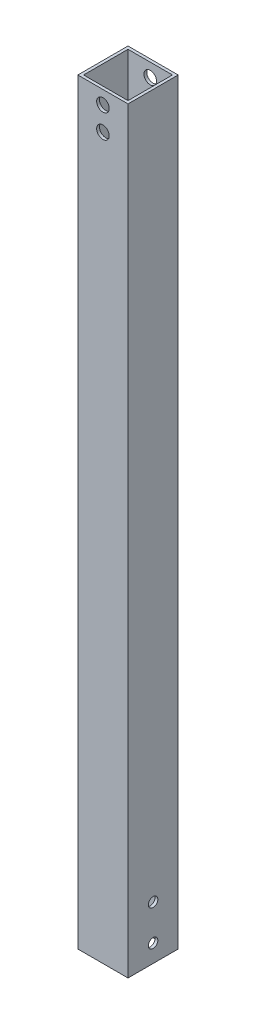
ISO-10303-21;
HEADER;
FILE_DESCRIPTION(('STEP AP214'),'2;1');
FILE_NAME('part.step','',(''),(''),'','','');
FILE_SCHEMA(('AUTOMOTIVE_DESIGN { 1 0 10303 214 1 1 1 1 }'));
ENDSEC;
DATA;
#1=APPLICATION_CONTEXT('core data for automotive mechanical design processes');
#2=APPLICATION_PROTOCOL_DEFINITION('international standard','automotive_design',2000,#1);
#3=PRODUCT_CONTEXT('',#1,'mechanical');
#4=PRODUCT('Part','Part','',(#3));
#5=PRODUCT_RELATED_PRODUCT_CATEGORY('part','',(#4));
#6=PRODUCT_DEFINITION_FORMATION('','',#4);
#7=PRODUCT_DEFINITION_CONTEXT('part definition',#1,'design');
#8=PRODUCT_DEFINITION('design','',#6,#7);
#9=PRODUCT_DEFINITION_SHAPE('','',#8);
#10=(LENGTH_UNIT() NAMED_UNIT(*) SI_UNIT(.MILLI.,.METRE.));
#11=(NAMED_UNIT(*) PLANE_ANGLE_UNIT() SI_UNIT($,.RADIAN.));
#12=(NAMED_UNIT(*) SI_UNIT($,.STERADIAN.) SOLID_ANGLE_UNIT());
#13=UNCERTAINTY_MEASURE_WITH_UNIT(LENGTH_MEASURE(1.E-05),#10,'distance_accuracy_value','');
#14=(GEOMETRIC_REPRESENTATION_CONTEXT(3) GLOBAL_UNCERTAINTY_ASSIGNED_CONTEXT((#13)) GLOBAL_UNIT_ASSIGNED_CONTEXT((#10,
#11,#12)) REPRESENTATION_CONTEXT('',''));
#15=CARTESIAN_POINT('',(0.,0.,0.));
#16=DIRECTION('',(0.,0.,1.));
#17=DIRECTION('',(1.,0.,0.));
#18=AXIS2_PLACEMENT_3D('',#15,#16,#17);
#19=CARTESIAN_POINT('',(0.,406.4,0.));
#20=DIRECTION('',(0.,1.,0.));
#21=DIRECTION('',(0.,0.,1.));
#22=AXIS2_PLACEMENT_3D('',#19,#20,#21);
#23=PLANE('',#22);
#24=DIRECTION('',(0.,0.,1.));
#25=VECTOR('',#24,1.);
#26=CARTESIAN_POINT('',(-13.462,406.4,12.7));
#27=LINE('',#26,#25);
#28=CARTESIAN_POINT('',(-13.462,406.4,-13.462));
#29=VERTEX_POINT('',#28);
#30=CARTESIAN_POINT('',(-13.462,406.4,13.462));
#31=VERTEX_POINT('',#30);
#32=EDGE_CURVE('E173',#29,#31,#27,.T.);
#33=ORIENTED_EDGE('',*,*,#32,.T.);
#34=DIRECTION('',(1.,0.,0.));
#35=VECTOR('',#34,1.);
#36=CARTESIAN_POINT('',(12.7,406.4,13.462));
#37=LINE('',#36,#35);
#38=CARTESIAN_POINT('',(13.462,406.4,13.462));
#39=VERTEX_POINT('',#38);
#40=EDGE_CURVE('E176',#31,#39,#37,.T.);
#41=ORIENTED_EDGE('',*,*,#40,.T.);
#42=DIRECTION('',(0.,0.,-1.));
#43=VECTOR('',#42,1.);
#44=CARTESIAN_POINT('',(13.462,406.4,12.7));
#45=LINE('',#44,#43);
#46=CARTESIAN_POINT('',(13.462,406.4,-13.462));
#47=VERTEX_POINT('',#46);
#48=EDGE_CURVE('E179',#39,#47,#45,.T.);
#49=ORIENTED_EDGE('',*,*,#48,.T.);
#50=DIRECTION('',(-1.,0.,0.));
#51=VECTOR('',#50,1.);
#52=CARTESIAN_POINT('',(12.7,406.4,-13.462));
#53=LINE('',#52,#51);
#54=EDGE_CURVE('E181',#47,#29,#53,.T.);
#55=ORIENTED_EDGE('',*,*,#54,.T.);
#56=EDGE_LOOP('',(#33,#41,#49,#55));
#57=FACE_BOUND('',#56,.T.);
#58=DIRECTION('',(1.,0.,0.));
#59=VECTOR('',#58,1.);
#60=CARTESIAN_POINT('',(12.7,406.4,11.938));
#61=LINE('',#60,#59);
#62=CARTESIAN_POINT('',(-11.938,406.4,11.938));
#63=VERTEX_POINT('',#62);
#64=CARTESIAN_POINT('',(11.938,406.4,11.938));
#65=VERTEX_POINT('',#64);
#66=EDGE_CURVE('E141',#63,#65,#61,.T.);
#67=ORIENTED_EDGE('',*,*,#66,.F.);
#68=DIRECTION('',(0.,0.,1.));
#69=VECTOR('',#68,1.);
#70=CARTESIAN_POINT('',(-11.938,406.4,12.7));
#71=LINE('',#70,#69);
#72=CARTESIAN_POINT('',(-11.938,406.4,-11.938));
#73=VERTEX_POINT('',#72);
#74=EDGE_CURVE('E133',#73,#63,#71,.T.);
#75=ORIENTED_EDGE('',*,*,#74,.F.);
#76=DIRECTION('',(-1.,0.,0.));
#77=VECTOR('',#76,1.);
#78=CARTESIAN_POINT('',(12.7,406.4,-11.938));
#79=LINE('',#78,#77);
#80=CARTESIAN_POINT('',(11.938,406.4,-11.938));
#81=VERTEX_POINT('',#80);
#82=EDGE_CURVE('E156',#81,#73,#79,.T.);
#83=ORIENTED_EDGE('',*,*,#82,.F.);
#84=DIRECTION('',(0.,0.,-1.));
#85=VECTOR('',#84,1.);
#86=CARTESIAN_POINT('',(11.938,406.4,12.7));
#87=LINE('',#86,#85);
#88=EDGE_CURVE('E154',#65,#81,#87,.T.);
#89=ORIENTED_EDGE('',*,*,#88,.F.);
#90=EDGE_LOOP('',(#67,#75,#83,#89));
#91=FACE_BOUND('',#90,.T.);
#92=ADVANCED_FACE('F65',(#57,#91),#23,.T.);
#93=CARTESIAN_POINT('',(0.,0.,0.));
#94=DIRECTION('',(0.,1.,0.));
#95=DIRECTION('',(0.,0.,1.));
#96=AXIS2_PLACEMENT_3D('',#93,#94,#95);
#97=PLANE('',#96);
#98=DIRECTION('',(0.,0.,1.));
#99=VECTOR('',#98,1.);
#100=CARTESIAN_POINT('',(-13.462,0.,12.7));
#101=LINE('',#100,#99);
#102=CARTESIAN_POINT('',(-13.462,0.,-13.462));
#103=VERTEX_POINT('',#102);
#104=CARTESIAN_POINT('',(-13.462,0.,13.462));
#105=VERTEX_POINT('',#104);
#106=EDGE_CURVE('E150',#103,#105,#101,.T.);
#107=ORIENTED_EDGE('',*,*,#106,.F.);
#108=DIRECTION('',(-1.,0.,0.));
#109=VECTOR('',#108,1.);
#110=CARTESIAN_POINT('',(12.7,0.,-13.462));
#111=LINE('',#110,#109);
#112=CARTESIAN_POINT('',(13.462,0.,-13.462));
#113=VERTEX_POINT('',#112);
#114=EDGE_CURVE('E177',#113,#103,#111,.T.);
#115=ORIENTED_EDGE('',*,*,#114,.F.);
#116=DIRECTION('',(0.,0.,-1.));
#117=VECTOR('',#116,1.);
#118=CARTESIAN_POINT('',(13.462,0.,12.7));
#119=LINE('',#118,#117);
#120=CARTESIAN_POINT('',(13.462,0.,13.462));
#121=VERTEX_POINT('',#120);
#122=EDGE_CURVE('E188',#121,#113,#119,.T.);
#123=ORIENTED_EDGE('',*,*,#122,.F.);
#124=DIRECTION('',(1.,0.,0.));
#125=VECTOR('',#124,1.);
#126=CARTESIAN_POINT('',(12.7,0.,13.462));
#127=LINE('',#126,#125);
#128=EDGE_CURVE('E186',#105,#121,#127,.T.);
#129=ORIENTED_EDGE('',*,*,#128,.F.);
#130=EDGE_LOOP('',(#107,#115,#123,#129));
#131=FACE_BOUND('',#130,.T.);
#132=DIRECTION('',(0.,0.,1.));
#133=VECTOR('',#132,1.);
#134=CARTESIAN_POINT('',(-11.938,0.,12.7));
#135=LINE('',#134,#133);
#136=CARTESIAN_POINT('',(-11.938,0.,-11.938));
#137=VERTEX_POINT('',#136);
#138=CARTESIAN_POINT('',(-11.938,0.,11.938));
#139=VERTEX_POINT('',#138);
#140=EDGE_CURVE('E91',#137,#139,#135,.T.);
#141=ORIENTED_EDGE('',*,*,#140,.T.);
#142=DIRECTION('',(1.,0.,0.));
#143=VECTOR('',#142,1.);
#144=CARTESIAN_POINT('',(12.7,0.,11.938));
#145=LINE('',#144,#143);
#146=CARTESIAN_POINT('',(11.938,0.,11.938));
#147=VERTEX_POINT('',#146);
#148=EDGE_CURVE('E148',#139,#147,#145,.T.);
#149=ORIENTED_EDGE('',*,*,#148,.T.);
#150=DIRECTION('',(0.,0.,-1.));
#151=VECTOR('',#150,1.);
#152=CARTESIAN_POINT('',(11.938,0.,12.7));
#153=LINE('',#152,#151);
#154=CARTESIAN_POINT('',(11.938,0.,-11.938));
#155=VERTEX_POINT('',#154);
#156=EDGE_CURVE('E164',#147,#155,#153,.T.);
#157=ORIENTED_EDGE('',*,*,#156,.T.);
#158=DIRECTION('',(-1.,0.,0.));
#159=VECTOR('',#158,1.);
#160=CARTESIAN_POINT('',(12.7,0.,-11.938));
#161=LINE('',#160,#159);
#162=EDGE_CURVE('E142',#155,#137,#161,.T.);
#163=ORIENTED_EDGE('',*,*,#162,.T.);
#164=EDGE_LOOP('',(#141,#149,#157,#163));
#165=FACE_BOUND('',#164,.T.);
#166=ADVANCED_FACE('F258',(#131,#165),#97,.F.);
#167=CARTESIAN_POINT('',(-13.462,406.4,12.7));
#168=DIRECTION('',(1.,0.,0.));
#169=DIRECTION('',(0.,0.,-1.));
#170=AXIS2_PLACEMENT_3D('',#167,#168,#169);
#171=PLANE('',#170);
#172=CARTESIAN_POINT('',(-13.462,9.525,0.));
#173=DIRECTION('',(1.,0.,0.));
#174=DIRECTION('',(0.,0.,-1.));
#175=AXIS2_PLACEMENT_3D('',#172,#173,#174);
#176=CIRCLE('',#175,2.55269999999998);
#177=CARTESIAN_POINT('',(-13.462,9.525,-2.55269999999998));
#178=VERTEX_POINT('',#177);
#179=EDGE_CURVE('E336',#178,#178,#176,.T.);
#180=ORIENTED_EDGE('',*,*,#179,.T.);
#181=EDGE_LOOP('',(#180));
#182=FACE_BOUND('',#181,.T.);
#183=CARTESIAN_POINT('',(-13.462,28.575,0.));
#184=DIRECTION('',(1.,0.,0.));
#185=DIRECTION('',(0.,0.,-1.));
#186=AXIS2_PLACEMENT_3D('',#183,#184,#185);
#187=CIRCLE('',#186,2.55269999999998);
#188=CARTESIAN_POINT('',(-13.462,28.575,-2.55269999999998));
#189=VERTEX_POINT('',#188);
#190=EDGE_CURVE('E210',#189,#189,#187,.T.);
#191=ORIENTED_EDGE('',*,*,#190,.T.);
#192=EDGE_LOOP('',(#191));
#193=FACE_BOUND('',#192,.T.);
#194=ORIENTED_EDGE('',*,*,#106,.T.);
#195=DIRECTION('',(0.,-1.,0.));
#196=VECTOR('',#195,1.);
#197=CARTESIAN_POINT('',(-13.462,406.4,13.462));
#198=LINE('',#197,#196);
#199=EDGE_CURVE('E12',#31,#105,#198,.T.);
#200=ORIENTED_EDGE('',*,*,#199,.F.);
#201=ORIENTED_EDGE('',*,*,#32,.F.);
#202=DIRECTION('',(0.,-1.,0.));
#203=VECTOR('',#202,1.);
#204=CARTESIAN_POINT('',(-13.462,406.4,-13.462));
#205=LINE('',#204,#203);
#206=EDGE_CURVE('E183',#29,#103,#205,.T.);
#207=ORIENTED_EDGE('',*,*,#206,.T.);
#208=EDGE_LOOP('',(#194,#200,#201,#207));
#209=FACE_BOUND('',#208,.T.);
#210=ADVANCED_FACE('F67',(#182,#193,#209),#171,.F.);
#211=CARTESIAN_POINT('',(12.7,406.4,13.462));
#212=DIRECTION('',(0.,0.,-1.));
#213=DIRECTION('',(-1.,0.,0.));
#214=AXIS2_PLACEMENT_3D('',#211,#212,#213);
#215=PLANE('',#214);
#216=CARTESIAN_POINT('',(1.36939071193609E-13,399.2245,13.462));
#217=DIRECTION('',(0.,0.,-1.));
#218=DIRECTION('',(-1.,0.,0.));
#219=AXIS2_PLACEMENT_3D('',#216,#217,#218);
#220=CIRCLE('',#219,3.37819999999998);
#221=CARTESIAN_POINT('',(-3.37819999999984,399.2245,13.462));
#222=VERTEX_POINT('',#221);
#223=EDGE_CURVE('E206',#222,#222,#220,.T.);
#224=ORIENTED_EDGE('',*,*,#223,.T.);
#225=EDGE_LOOP('',(#224));
#226=FACE_BOUND('',#225,.T.);
#227=CARTESIAN_POINT('',(1.68164093761192E-13,386.5245,13.462));
#228=DIRECTION('',(0.,0.,-1.));
#229=DIRECTION('',(-1.,0.,0.));
#230=AXIS2_PLACEMENT_3D('',#227,#228,#229);
#231=CIRCLE('',#230,3.37819999999998);
#232=CARTESIAN_POINT('',(-3.37819999999981,386.5245,13.462));
#233=VERTEX_POINT('',#232);
#234=EDGE_CURVE('E202',#233,#233,#231,.T.);
#235=ORIENTED_EDGE('',*,*,#234,.T.);
#236=EDGE_LOOP('',(#235));
#237=FACE_BOUND('',#236,.T.);
#238=ORIENTED_EDGE('',*,*,#128,.T.);
#239=DIRECTION('',(0.,-1.,0.));
#240=VECTOR('',#239,1.);
#241=CARTESIAN_POINT('',(13.462,406.4,13.462));
#242=LINE('',#241,#240);
#243=EDGE_CURVE('E75',#39,#121,#242,.T.);
#244=ORIENTED_EDGE('',*,*,#243,.F.);
#245=ORIENTED_EDGE('',*,*,#40,.F.);
#246=ORIENTED_EDGE('',*,*,#199,.T.);
#247=EDGE_LOOP('',(#238,#244,#245,#246));
#248=FACE_BOUND('',#247,.T.);
#249=ADVANCED_FACE('F272',(#226,#237,#248),#215,.F.);
#250=CARTESIAN_POINT('',(13.462,406.4,12.7));
#251=DIRECTION('',(-1.,0.,0.));
#252=DIRECTION('',(0.,0.,1.));
#253=AXIS2_PLACEMENT_3D('',#250,#251,#252);
#254=PLANE('',#253);
#255=CARTESIAN_POINT('',(13.462,9.525,0.));
#256=DIRECTION('',(1.,0.,0.));
#257=DIRECTION('',(0.,0.,-1.));
#258=AXIS2_PLACEMENT_3D('',#255,#256,#257);
#259=CIRCLE('',#258,2.55269999999999);
#260=CARTESIAN_POINT('',(13.462,9.525,-2.55269999999999));
#261=VERTEX_POINT('',#260);
#262=EDGE_CURVE('E335',#261,#261,#259,.T.);
#263=ORIENTED_EDGE('',*,*,#262,.F.);
#264=EDGE_LOOP('',(#263));
#265=FACE_BOUND('',#264,.T.);
#266=CARTESIAN_POINT('',(13.462,28.575,0.));
#267=DIRECTION('',(1.,0.,0.));
#268=DIRECTION('',(0.,0.,-1.));
#269=AXIS2_PLACEMENT_3D('',#266,#267,#268);
#270=CIRCLE('',#269,2.55269999999999);
#271=CARTESIAN_POINT('',(13.462,28.575,-2.55269999999999));
#272=VERTEX_POINT('',#271);
#273=EDGE_CURVE('E217',#272,#272,#270,.T.);
#274=ORIENTED_EDGE('',*,*,#273,.F.);
#275=EDGE_LOOP('',(#274));
#276=FACE_BOUND('',#275,.T.);
#277=ORIENTED_EDGE('',*,*,#122,.T.);
#278=DIRECTION('',(0.,-1.,0.));
#279=VECTOR('',#278,1.);
#280=CARTESIAN_POINT('',(13.462,406.4,-13.462));
#281=LINE('',#280,#279);
#282=EDGE_CURVE('E193',#47,#113,#281,.T.);
#283=ORIENTED_EDGE('',*,*,#282,.F.);
#284=ORIENTED_EDGE('',*,*,#48,.F.);
#285=ORIENTED_EDGE('',*,*,#243,.T.);
#286=EDGE_LOOP('',(#277,#283,#284,#285));
#287=FACE_BOUND('',#286,.T.);
#288=ADVANCED_FACE('F269',(#265,#276,#287),#254,.F.);
#289=CARTESIAN_POINT('',(12.7,406.4,-13.462));
#290=DIRECTION('',(0.,0.,1.));
#291=DIRECTION('',(1.,0.,0.));
#292=AXIS2_PLACEMENT_3D('',#289,#290,#291);
#293=PLANE('',#292);
#294=CARTESIAN_POINT('',(1.36939071193609E-13,399.2245,-13.462));
#295=DIRECTION('',(0.,0.,-1.));
#296=DIRECTION('',(-1.,0.,0.));
#297=AXIS2_PLACEMENT_3D('',#294,#295,#296);
#298=CIRCLE('',#297,3.37819999999998);
#299=CARTESIAN_POINT('',(-3.37819999999984,399.2245,-13.462));
#300=VERTEX_POINT('',#299);
#301=EDGE_CURVE('E214',#300,#300,#298,.T.);
#302=ORIENTED_EDGE('',*,*,#301,.F.);
#303=EDGE_LOOP('',(#302));
#304=FACE_BOUND('',#303,.T.);
#305=CARTESIAN_POINT('',(1.68164093761192E-13,386.5245,-13.462));
#306=DIRECTION('',(0.,0.,-1.));
#307=DIRECTION('',(-1.,0.,0.));
#308=AXIS2_PLACEMENT_3D('',#305,#306,#307);
#309=CIRCLE('',#308,3.37819999999998);
#310=CARTESIAN_POINT('',(-3.37819999999981,386.5245,-13.462));
#311=VERTEX_POINT('',#310);
#312=EDGE_CURVE('E232',#311,#311,#309,.T.);
#313=ORIENTED_EDGE('',*,*,#312,.F.);
#314=EDGE_LOOP('',(#313));
#315=FACE_BOUND('',#314,.T.);
#316=ORIENTED_EDGE('',*,*,#114,.T.);
#317=ORIENTED_EDGE('',*,*,#206,.F.);
#318=ORIENTED_EDGE('',*,*,#54,.F.);
#319=ORIENTED_EDGE('',*,*,#282,.T.);
#320=EDGE_LOOP('',(#316,#317,#318,#319));
#321=FACE_BOUND('',#320,.T.);
#322=ADVANCED_FACE('F253',(#304,#315,#321),#293,.F.);
#323=CARTESIAN_POINT('',(-11.938,406.4,12.7));
#324=DIRECTION('',(1.,0.,0.));
#325=DIRECTION('',(0.,0.,-1.));
#326=AXIS2_PLACEMENT_3D('',#323,#324,#325);
#327=PLANE('',#326);
#328=CARTESIAN_POINT('',(-11.938,9.525,0.));
#329=DIRECTION('',(1.,0.,0.));
#330=DIRECTION('',(0.,0.,-1.));
#331=AXIS2_PLACEMENT_3D('',#328,#329,#330);
#332=CIRCLE('',#331,2.55269999999998);
#333=CARTESIAN_POINT('',(-11.938,9.525,-2.55269999999998));
#334=VERTEX_POINT('',#333);
#335=EDGE_CURVE('E222',#334,#334,#332,.T.);
#336=ORIENTED_EDGE('',*,*,#335,.F.);
#337=EDGE_LOOP('',(#336));
#338=FACE_BOUND('',#337,.T.);
#339=CARTESIAN_POINT('',(-11.938,28.575,0.));
#340=DIRECTION('',(1.,0.,0.));
#341=DIRECTION('',(0.,0.,-1.));
#342=AXIS2_PLACEMENT_3D('',#339,#340,#341);
#343=CIRCLE('',#342,2.55269999999998);
#344=CARTESIAN_POINT('',(-11.938,28.575,-2.55269999999998));
#345=VERTEX_POINT('',#344);
#346=EDGE_CURVE('E209',#345,#345,#343,.T.);
#347=ORIENTED_EDGE('',*,*,#346,.F.);
#348=EDGE_LOOP('',(#347));
#349=FACE_BOUND('',#348,.T.);
#350=ORIENTED_EDGE('',*,*,#140,.F.);
#351=DIRECTION('',(0.,-1.,0.));
#352=VECTOR('',#351,1.);
#353=CARTESIAN_POINT('',(-11.938,406.4,-11.938));
#354=LINE('',#353,#352);
#355=EDGE_CURVE('E137',#73,#137,#354,.T.);
#356=ORIENTED_EDGE('',*,*,#355,.F.);
#357=ORIENTED_EDGE('',*,*,#74,.T.);
#358=DIRECTION('',(0.,-1.,0.));
#359=VECTOR('',#358,1.);
#360=CARTESIAN_POINT('',(-11.938,406.4,11.938));
#361=LINE('',#360,#359);
#362=EDGE_CURVE('E136',#63,#139,#361,.T.);
#363=ORIENTED_EDGE('',*,*,#362,.T.);
#364=EDGE_LOOP('',(#350,#356,#357,#363));
#365=FACE_BOUND('',#364,.T.);
#366=ADVANCED_FACE('F135',(#338,#349,#365),#327,.T.);
#367=CARTESIAN_POINT('',(12.7,406.4,11.938));
#368=DIRECTION('',(0.,0.,-1.));
#369=DIRECTION('',(-1.,0.,0.));
#370=AXIS2_PLACEMENT_3D('',#367,#368,#369);
#371=PLANE('',#370);
#372=CARTESIAN_POINT('',(1.36939071193609E-13,399.2245,11.938));
#373=DIRECTION('',(0.,0.,-1.));
#374=DIRECTION('',(-1.,0.,0.));
#375=AXIS2_PLACEMENT_3D('',#372,#373,#374);
#376=CIRCLE('',#375,3.37819999999998);
#377=CARTESIAN_POINT('',(-3.37819999999984,399.2245,11.938));
#378=VERTEX_POINT('',#377);
#379=EDGE_CURVE('E205',#378,#378,#376,.T.);
#380=ORIENTED_EDGE('',*,*,#379,.F.);
#381=EDGE_LOOP('',(#380));
#382=FACE_BOUND('',#381,.T.);
#383=CARTESIAN_POINT('',(1.68164093761192E-13,386.5245,11.938));
#384=DIRECTION('',(0.,0.,-1.));
#385=DIRECTION('',(-1.,0.,0.));
#386=AXIS2_PLACEMENT_3D('',#383,#384,#385);
#387=CIRCLE('',#386,3.37819999999998);
#388=CARTESIAN_POINT('',(-3.37819999999981,386.5245,11.938));
#389=VERTEX_POINT('',#388);
#390=EDGE_CURVE('E162',#389,#389,#387,.T.);
#391=ORIENTED_EDGE('',*,*,#390,.F.);
#392=EDGE_LOOP('',(#391));
#393=FACE_BOUND('',#392,.T.);
#394=ORIENTED_EDGE('',*,*,#148,.F.);
#395=ORIENTED_EDGE('',*,*,#362,.F.);
#396=ORIENTED_EDGE('',*,*,#66,.T.);
#397=DIRECTION('',(0.,-1.,0.));
#398=VECTOR('',#397,1.);
#399=CARTESIAN_POINT('',(11.938,406.4,11.938));
#400=LINE('',#399,#398);
#401=EDGE_CURVE('E151',#65,#147,#400,.T.);
#402=ORIENTED_EDGE('',*,*,#401,.T.);
#403=EDGE_LOOP('',(#394,#395,#396,#402));
#404=FACE_BOUND('',#403,.T.);
#405=ADVANCED_FACE('F145',(#382,#393,#404),#371,.T.);
#406=CARTESIAN_POINT('',(11.938,406.4,12.7));
#407=DIRECTION('',(-1.,0.,0.));
#408=DIRECTION('',(0.,0.,1.));
#409=AXIS2_PLACEMENT_3D('',#406,#407,#408);
#410=PLANE('',#409);
#411=CARTESIAN_POINT('',(11.938,9.525,0.));
#412=DIRECTION('',(-1.,0.,0.));
#413=DIRECTION('',(0.,0.,1.));
#414=AXIS2_PLACEMENT_3D('',#411,#412,#413);
#415=CIRCLE('',#414,2.55269999999998);
#416=CARTESIAN_POINT('',(11.938,9.525,2.55269999999998));
#417=VERTEX_POINT('',#416);
#418=EDGE_CURVE('E69',#417,#417,#415,.T.);
#419=ORIENTED_EDGE('',*,*,#418,.F.);
#420=EDGE_LOOP('',(#419));
#421=FACE_BOUND('',#420,.T.);
#422=CARTESIAN_POINT('',(11.938,28.575,0.));
#423=DIRECTION('',(-1.,0.,0.));
#424=DIRECTION('',(0.,0.,1.));
#425=AXIS2_PLACEMENT_3D('',#422,#423,#424);
#426=CIRCLE('',#425,2.55269999999998);
#427=CARTESIAN_POINT('',(11.938,28.575,2.55269999999998));
#428=VERTEX_POINT('',#427);
#429=EDGE_CURVE('E207',#428,#428,#426,.T.);
#430=ORIENTED_EDGE('',*,*,#429,.F.);
#431=EDGE_LOOP('',(#430));
#432=FACE_BOUND('',#431,.T.);
#433=ORIENTED_EDGE('',*,*,#156,.F.);
#434=ORIENTED_EDGE('',*,*,#401,.F.);
#435=ORIENTED_EDGE('',*,*,#88,.T.);
#436=DIRECTION('',(0.,-1.,0.));
#437=VECTOR('',#436,1.);
#438=CARTESIAN_POINT('',(11.938,406.4,-11.938));
#439=LINE('',#438,#437);
#440=EDGE_CURVE('E83',#81,#155,#439,.T.);
#441=ORIENTED_EDGE('',*,*,#440,.T.);
#442=EDGE_LOOP('',(#433,#434,#435,#441));
#443=FACE_BOUND('',#442,.T.);
#444=ADVANCED_FACE('F243',(#421,#432,#443),#410,.T.);
#445=CARTESIAN_POINT('',(12.7,406.4,-11.938));
#446=DIRECTION('',(0.,0.,1.));
#447=DIRECTION('',(1.,0.,0.));
#448=AXIS2_PLACEMENT_3D('',#445,#446,#447);
#449=PLANE('',#448);
#450=CARTESIAN_POINT('',(1.36939071193609E-13,399.2245,-11.938));
#451=DIRECTION('',(0.,0.,1.));
#452=DIRECTION('',(1.,0.,0.));
#453=AXIS2_PLACEMENT_3D('',#450,#451,#452);
#454=CIRCLE('',#453,3.37819999999998);
#455=CARTESIAN_POINT('',(3.37820000000012,399.2245,-11.938));
#456=VERTEX_POINT('',#455);
#457=EDGE_CURVE('E203',#456,#456,#454,.T.);
#458=ORIENTED_EDGE('',*,*,#457,.F.);
#459=EDGE_LOOP('',(#458));
#460=FACE_BOUND('',#459,.T.);
#461=CARTESIAN_POINT('',(1.68164093761192E-13,386.5245,-11.938));
#462=DIRECTION('',(0.,0.,1.));
#463=DIRECTION('',(1.,0.,0.));
#464=AXIS2_PLACEMENT_3D('',#461,#462,#463);
#465=CIRCLE('',#464,3.37819999999998);
#466=CARTESIAN_POINT('',(3.37820000000015,386.5245,-11.938));
#467=VERTEX_POINT('',#466);
#468=EDGE_CURVE('E199',#467,#467,#465,.T.);
#469=ORIENTED_EDGE('',*,*,#468,.F.);
#470=EDGE_LOOP('',(#469));
#471=FACE_BOUND('',#470,.T.);
#472=ORIENTED_EDGE('',*,*,#162,.F.);
#473=ORIENTED_EDGE('',*,*,#440,.F.);
#474=ORIENTED_EDGE('',*,*,#82,.T.);
#475=ORIENTED_EDGE('',*,*,#355,.T.);
#476=EDGE_LOOP('',(#472,#473,#474,#475));
#477=FACE_BOUND('',#476,.T.);
#478=ADVANCED_FACE('F250',(#460,#471,#477),#449,.T.);
#479=CARTESIAN_POINT('',(1.68164093761192E-13,386.5245,-13.462));
#480=DIRECTION('',(0.,0.,-1.));
#481=DIRECTION('',(-1.,0.,0.));
#482=AXIS2_PLACEMENT_3D('',#479,#480,#481);
#483=CYLINDRICAL_SURFACE('',#482,3.37819999999998);
#484=ORIENTED_EDGE('',*,*,#468,.T.);
#485=EDGE_LOOP('',(#484));
#486=FACE_BOUND('',#485,.T.);
#487=ORIENTED_EDGE('',*,*,#312,.T.);
#488=EDGE_LOOP('',(#487));
#489=FACE_BOUND('',#488,.T.);
#490=ADVANCED_FACE('F300',(#486,#489),#483,.F.);
#491=ORIENTED_EDGE('',*,*,#390,.T.);
#492=EDGE_LOOP('',(#491));
#493=FACE_BOUND('',#492,.T.);
#494=ORIENTED_EDGE('',*,*,#234,.F.);
#495=EDGE_LOOP('',(#494));
#496=FACE_BOUND('',#495,.T.);
#497=ADVANCED_FACE('F239',(#493,#496),#483,.F.);
#498=CARTESIAN_POINT('',(1.36939071193609E-13,399.2245,-13.462));
#499=DIRECTION('',(0.,0.,-1.));
#500=DIRECTION('',(-1.,0.,0.));
#501=AXIS2_PLACEMENT_3D('',#498,#499,#500);
#502=CYLINDRICAL_SURFACE('',#501,3.37819999999998);
#503=ORIENTED_EDGE('',*,*,#457,.T.);
#504=EDGE_LOOP('',(#503));
#505=FACE_BOUND('',#504,.T.);
#506=ORIENTED_EDGE('',*,*,#301,.T.);
#507=EDGE_LOOP('',(#506));
#508=FACE_BOUND('',#507,.T.);
#509=ADVANCED_FACE('F311',(#505,#508),#502,.F.);
#510=ORIENTED_EDGE('',*,*,#379,.T.);
#511=EDGE_LOOP('',(#510));
#512=FACE_BOUND('',#511,.T.);
#513=ORIENTED_EDGE('',*,*,#223,.F.);
#514=EDGE_LOOP('',(#513));
#515=FACE_BOUND('',#514,.T.);
#516=ADVANCED_FACE('F314',(#512,#515),#502,.F.);
#517=CARTESIAN_POINT('',(13.462,28.575,0.));
#518=DIRECTION('',(1.,0.,0.));
#519=DIRECTION('',(0.,0.,-1.));
#520=AXIS2_PLACEMENT_3D('',#517,#518,#519);
#521=CYLINDRICAL_SURFACE('',#520,2.55269999999998);
#522=ORIENTED_EDGE('',*,*,#429,.T.);
#523=EDGE_LOOP('',(#522));
#524=FACE_BOUND('',#523,.T.);
#525=ORIENTED_EDGE('',*,*,#273,.T.);
#526=EDGE_LOOP('',(#525));
#527=FACE_BOUND('',#526,.T.);
#528=ADVANCED_FACE('F316',(#524,#527),#521,.F.);
#529=ORIENTED_EDGE('',*,*,#346,.T.);
#530=EDGE_LOOP('',(#529));
#531=FACE_BOUND('',#530,.T.);
#532=ORIENTED_EDGE('',*,*,#190,.F.);
#533=EDGE_LOOP('',(#532));
#534=FACE_BOUND('',#533,.T.);
#535=ADVANCED_FACE('F319',(#531,#534),#521,.F.);
#536=CARTESIAN_POINT('',(13.462,9.525,0.));
#537=DIRECTION('',(1.,0.,0.));
#538=DIRECTION('',(0.,0.,-1.));
#539=AXIS2_PLACEMENT_3D('',#536,#537,#538);
#540=CYLINDRICAL_SURFACE('',#539,2.55269999999998);
#541=ORIENTED_EDGE('',*,*,#418,.T.);
#542=EDGE_LOOP('',(#541));
#543=FACE_BOUND('',#542,.T.);
#544=ORIENTED_EDGE('',*,*,#262,.T.);
#545=EDGE_LOOP('',(#544));
#546=FACE_BOUND('',#545,.T.);
#547=ADVANCED_FACE('F320',(#543,#546),#540,.F.);
#548=ORIENTED_EDGE('',*,*,#335,.T.);
#549=EDGE_LOOP('',(#548));
#550=FACE_BOUND('',#549,.T.);
#551=ORIENTED_EDGE('',*,*,#179,.F.);
#552=EDGE_LOOP('',(#551));
#553=FACE_BOUND('',#552,.T.);
#554=ADVANCED_FACE('F322',(#550,#553),#540,.F.);
#555=CLOSED_SHELL('',(#92,#166,#210,#249,#288,#322,#366,#405,#444,#478,#490,#497,#509,#516,#528,
#535,#547,#554));
#556=MANIFOLD_SOLID_BREP('B2',#555);
#557=ADVANCED_BREP_SHAPE_REPRESENTATION('',(#18,#556),#14);
#558=SHAPE_DEFINITION_REPRESENTATION(#9,#557);
ENDSEC;
END-ISO-10303-21;
